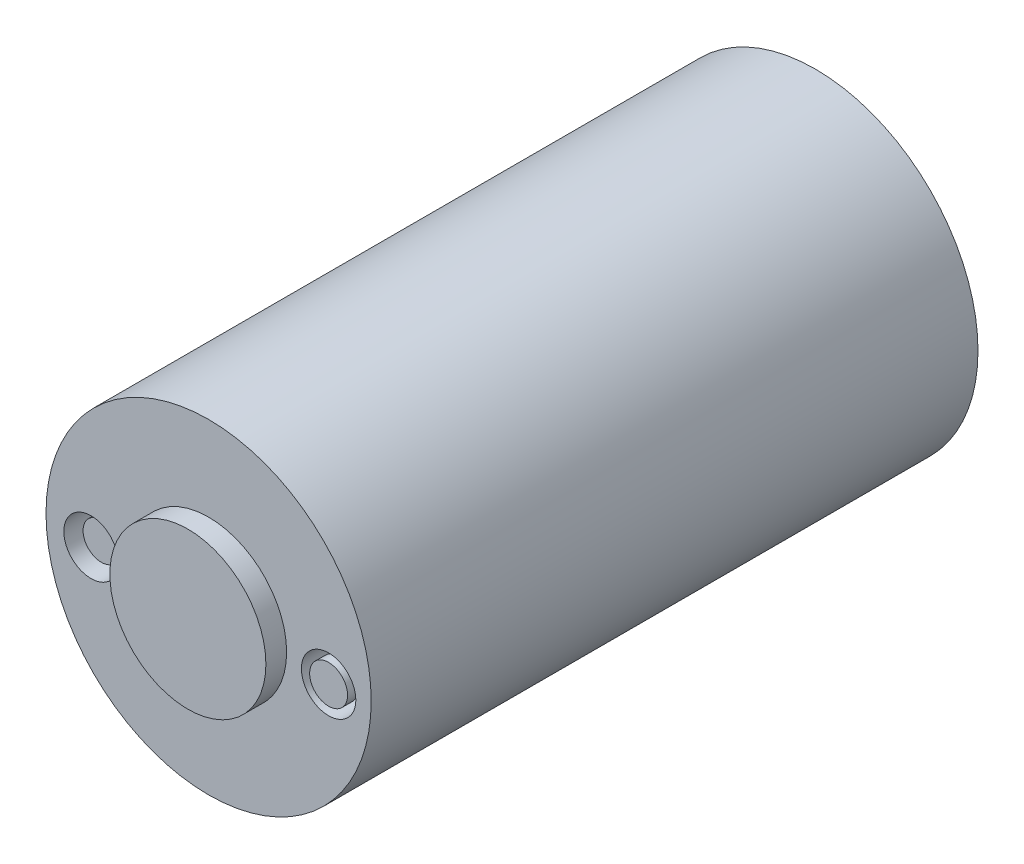
ISO-10303-21;
HEADER;
FILE_DESCRIPTION(('STEP AP214'),'2;1');
FILE_NAME('part.step','',(''),(''),'','','');
FILE_SCHEMA(('AUTOMOTIVE_DESIGN { 1 0 10303 214 1 1 1 1 }'));
ENDSEC;
DATA;
#1=APPLICATION_CONTEXT('core data for automotive mechanical design processes');
#2=APPLICATION_PROTOCOL_DEFINITION('international standard','automotive_design',2000,#1);
#3=PRODUCT_CONTEXT('',#1,'mechanical');
#4=PRODUCT('Part','Part','',(#3));
#5=PRODUCT_RELATED_PRODUCT_CATEGORY('part','',(#4));
#6=PRODUCT_DEFINITION_FORMATION('','',#4);
#7=PRODUCT_DEFINITION_CONTEXT('part definition',#1,'design');
#8=PRODUCT_DEFINITION('design','',#6,#7);
#9=PRODUCT_DEFINITION_SHAPE('','',#8);
#10=(LENGTH_UNIT() NAMED_UNIT(*) SI_UNIT(.MILLI.,.METRE.));
#11=(NAMED_UNIT(*) PLANE_ANGLE_UNIT() SI_UNIT($,.RADIAN.));
#12=(NAMED_UNIT(*) SI_UNIT($,.STERADIAN.) SOLID_ANGLE_UNIT());
#13=UNCERTAINTY_MEASURE_WITH_UNIT(LENGTH_MEASURE(1.E-05),#10,'distance_accuracy_value','');
#14=(GEOMETRIC_REPRESENTATION_CONTEXT(3) GLOBAL_UNCERTAINTY_ASSIGNED_CONTEXT((#13)) GLOBAL_UNIT_ASSIGNED_CONTEXT((#10,
#11,#12)) REPRESENTATION_CONTEXT('',''));
#15=CARTESIAN_POINT('',(0.,0.,0.));
#16=DIRECTION('',(0.,0.,1.));
#17=DIRECTION('',(1.,0.,0.));
#18=AXIS2_PLACEMENT_3D('',#15,#16,#17);
#19=CARTESIAN_POINT('',(-4.24278243774345,8.16431836687368,110.22));
#20=DIRECTION('',(0.,0.,-1.));
#21=DIRECTION('',(-1.,0.,0.));
#22=AXIS2_PLACEMENT_3D('',#19,#20,#21);
#23=CYLINDRICAL_SURFACE('',#22,3.6644848383554);
#24=CARTESIAN_POINT('',(-4.24278243774345,8.16431836687368,110.22));
#25=DIRECTION('',(0.,0.,1.));
#26=DIRECTION('',(1.,0.,0.));
#27=AXIS2_PLACEMENT_3D('',#24,#25,#26);
#28=CIRCLE('',#27,3.6644848383554);
#29=CARTESIAN_POINT('',(-0.578297599388054,8.16431836687368,110.22));
#30=VERTEX_POINT('',#29);
#31=EDGE_CURVE('E11',#30,#30,#28,.T.);
#32=ORIENTED_EDGE('',*,*,#31,.F.);
#33=EDGE_LOOP('',(#32));
#34=FACE_BOUND('',#33,.T.);
#35=CARTESIAN_POINT('',(-4.24278243774345,8.16431836687368,108.22));
#36=DIRECTION('',(0.,0.,1.));
#37=DIRECTION('',(1.,0.,0.));
#38=AXIS2_PLACEMENT_3D('',#35,#36,#37);
#39=CIRCLE('',#38,3.6644848383554);
#40=CARTESIAN_POINT('',(-0.578297599388054,8.16431836687368,108.22));
#41=VERTEX_POINT('',#40);
#42=EDGE_CURVE('E43',#41,#41,#39,.T.);
#43=ORIENTED_EDGE('',*,*,#42,.T.);
#44=EDGE_LOOP('',(#43));
#45=FACE_BOUND('',#44,.T.);
#46=ADVANCED_FACE('F40',(#34,#45),#23,.T.);
#47=CARTESIAN_POINT('',(-4.24278243774345,8.16431836687368,110.22));
#48=DIRECTION('',(0.,0.,1.));
#49=DIRECTION('',(1.,0.,0.));
#50=AXIS2_PLACEMENT_3D('',#47,#48,#49);
#51=PLANE('',#50);
#52=ORIENTED_EDGE('',*,*,#31,.T.);
#53=EDGE_LOOP('',(#52));
#54=FACE_BOUND('',#53,.T.);
#55=ADVANCED_FACE('F55',(#54),#51,.T.);
#56=CARTESIAN_POINT('',(-4.24278243774345,8.16431836687368,108.22));
#57=DIRECTION('',(0.,0.,1.));
#58=DIRECTION('',(1.,0.,0.));
#59=AXIS2_PLACEMENT_3D('',#56,#57,#58);
#60=PLANE('',#59);
#61=ORIENTED_EDGE('',*,*,#42,.F.);
#62=EDGE_LOOP('',(#61));
#63=FACE_BOUND('',#62,.T.);
#64=ADVANCED_FACE('F53',(#63),#60,.F.);
#65=CLOSED_SHELL('',(#46,#55,#64));
#66=MANIFOLD_SOLID_BREP('B2',#65);
#67=CARTESIAN_POINT('',(-27.4092450329609,9.47602080551931,110.22));
#68=DIRECTION('',(0.,0.,-1.));
#69=DIRECTION('',(-1.,0.,0.));
#70=AXIS2_PLACEMENT_3D('',#67,#68,#69);
#71=CYLINDRICAL_SURFACE('',#70,31.385);
#72=CARTESIAN_POINT('',(-27.4092450329609,9.47602080551931,110.22));
#73=DIRECTION('',(0.,0.,1.));
#74=DIRECTION('',(1.,0.,0.));
#75=AXIS2_PLACEMENT_3D('',#72,#73,#74);
#76=CIRCLE('',#75,31.385);
#77=CARTESIAN_POINT('',(3.97575496703907,9.47602080551931,110.22));
#78=VERTEX_POINT('',#77);
#79=EDGE_CURVE('E39',#78,#78,#76,.T.);
#80=ORIENTED_EDGE('',*,*,#79,.F.);
#81=EDGE_LOOP('',(#80));
#82=FACE_BOUND('',#81,.T.);
#83=CARTESIAN_POINT('',(-27.4092450329609,9.47602080551931,-6.91));
#84=DIRECTION('',(0.,0.,-1.));
#85=DIRECTION('',(-1.,0.,0.));
#86=AXIS2_PLACEMENT_3D('',#83,#84,#85);
#87=CIRCLE('',#86,31.385);
#88=CARTESIAN_POINT('',(-58.7942450329609,9.47602080551931,-6.91));
#89=VERTEX_POINT('',#88);
#90=EDGE_CURVE('E112',#89,#89,#87,.T.);
#91=ORIENTED_EDGE('',*,*,#90,.F.);
#92=EDGE_LOOP('',(#91));
#93=FACE_BOUND('',#92,.T.);
#94=ADVANCED_FACE('F80',(#82,#93),#71,.T.);
#95=CARTESIAN_POINT('',(-27.4092450329609,9.47602080551931,110.22));
#96=DIRECTION('',(0.,0.,1.));
#97=DIRECTION('',(1.,0.,0.));
#98=AXIS2_PLACEMENT_3D('',#95,#96,#97);
#99=PLANE('',#98);
#100=CARTESIAN_POINT('',(-50.097416884523,8.16431836687368,110.22));
#101=DIRECTION('',(0.,0.,1.));
#102=DIRECTION('',(1.,0.,0.));
#103=AXIS2_PLACEMENT_3D('',#100,#101,#102);
#104=CIRCLE('',#103,5.255);
#105=CARTESIAN_POINT('',(-44.842416884523,8.16431836687368,110.22));
#106=VERTEX_POINT('',#105);
#107=EDGE_CURVE('E103',#106,#106,#104,.T.);
#108=ORIENTED_EDGE('',*,*,#107,.F.);
#109=EDGE_LOOP('',(#108));
#110=FACE_BOUND('',#109,.T.);
#111=CARTESIAN_POINT('',(-4.24278243774345,8.16431836687368,110.22));
#112=DIRECTION('',(0.,0.,1.));
#113=DIRECTION('',(1.,0.,0.));
#114=AXIS2_PLACEMENT_3D('',#111,#112,#113);
#115=CIRCLE('',#114,5.255);
#116=CARTESIAN_POINT('',(1.01221756225655,8.16431836687368,110.22));
#117=VERTEX_POINT('',#116);
#118=EDGE_CURVE('E97',#117,#117,#115,.T.);
#119=ORIENTED_EDGE('',*,*,#118,.F.);
#120=EDGE_LOOP('',(#119));
#121=FACE_BOUND('',#120,.T.);
#122=CARTESIAN_POINT('',(-27.4092450329609,9.47602080551931,110.22));
#123=DIRECTION('',(0.,0.,1.));
#124=DIRECTION('',(1.,0.,0.));
#125=AXIS2_PLACEMENT_3D('',#122,#123,#124);
#126=CIRCLE('',#125,15.06);
#127=CARTESIAN_POINT('',(-12.3492450329609,9.47602080551931,110.22));
#128=VERTEX_POINT('',#127);
#129=EDGE_CURVE('E90',#128,#128,#126,.T.);
#130=ORIENTED_EDGE('',*,*,#129,.F.);
#131=EDGE_LOOP('',(#130));
#132=FACE_BOUND('',#131,.T.);
#133=ORIENTED_EDGE('',*,*,#79,.T.);
#134=EDGE_LOOP('',(#133));
#135=FACE_BOUND('',#134,.T.);
#136=ADVANCED_FACE('F121',(#110,#121,#132,#135),#99,.T.);
#137=CARTESIAN_POINT('',(-27.4092450329609,9.47602080551931,114.22));
#138=DIRECTION('',(0.,0.,-1.));
#139=DIRECTION('',(-1.,0.,0.));
#140=AXIS2_PLACEMENT_3D('',#137,#138,#139);
#141=CYLINDRICAL_SURFACE('',#140,15.06);
#142=CARTESIAN_POINT('',(-27.4092450329609,9.47602080551931,114.22));
#143=DIRECTION('',(0.,0.,1.));
#144=DIRECTION('',(1.,0.,0.));
#145=AXIS2_PLACEMENT_3D('',#142,#143,#144);
#146=CIRCLE('',#145,15.06);
#147=CARTESIAN_POINT('',(-12.3492450329609,9.47602080551931,114.22));
#148=VERTEX_POINT('',#147);
#149=EDGE_CURVE('E86',#148,#148,#146,.T.);
#150=ORIENTED_EDGE('',*,*,#149,.F.);
#151=EDGE_LOOP('',(#150));
#152=FACE_BOUND('',#151,.T.);
#153=ORIENTED_EDGE('',*,*,#129,.T.);
#154=EDGE_LOOP('',(#153));
#155=FACE_BOUND('',#154,.T.);
#156=ADVANCED_FACE('F126',(#152,#155),#141,.T.);
#157=CARTESIAN_POINT('',(-27.4092450329609,9.47602080551931,114.22));
#158=DIRECTION('',(0.,0.,1.));
#159=DIRECTION('',(1.,0.,0.));
#160=AXIS2_PLACEMENT_3D('',#157,#158,#159);
#161=PLANE('',#160);
#162=ORIENTED_EDGE('',*,*,#149,.T.);
#163=EDGE_LOOP('',(#162));
#164=FACE_BOUND('',#163,.T.);
#165=ADVANCED_FACE('F131',(#164),#161,.T.);
#166=CARTESIAN_POINT('',(-4.24278243774345,8.16431836687368,100.22));
#167=DIRECTION('',(0.,0.,1.));
#168=DIRECTION('',(1.,0.,0.));
#169=AXIS2_PLACEMENT_3D('',#166,#167,#168);
#170=CYLINDRICAL_SURFACE('',#169,5.255);
#171=CARTESIAN_POINT('',(-4.24278243774345,8.16431836687368,100.22));
#172=DIRECTION('',(0.,0.,1.));
#173=DIRECTION('',(1.,0.,0.));
#174=AXIS2_PLACEMENT_3D('',#171,#172,#173);
#175=CIRCLE('',#174,5.255);
#176=CARTESIAN_POINT('',(1.01221756225655,8.16431836687368,100.22));
#177=VERTEX_POINT('',#176);
#178=EDGE_CURVE('E95',#177,#177,#175,.T.);
#179=ORIENTED_EDGE('',*,*,#178,.F.);
#180=EDGE_LOOP('',(#179));
#181=FACE_BOUND('',#180,.T.);
#182=ORIENTED_EDGE('',*,*,#118,.T.);
#183=EDGE_LOOP('',(#182));
#184=FACE_BOUND('',#183,.T.);
#185=ADVANCED_FACE('F139',(#181,#184),#170,.F.);
#186=CARTESIAN_POINT('',(-4.24278243774345,8.16431836687368,100.22));
#187=DIRECTION('',(0.,0.,1.));
#188=DIRECTION('',(1.,0.,0.));
#189=AXIS2_PLACEMENT_3D('',#186,#187,#188);
#190=PLANE('',#189);
#191=ORIENTED_EDGE('',*,*,#178,.T.);
#192=EDGE_LOOP('',(#191));
#193=FACE_BOUND('',#192,.T.);
#194=ADVANCED_FACE('F142',(#193),#190,.T.);
#195=CARTESIAN_POINT('',(-50.097416884523,8.16431836687368,100.22));
#196=DIRECTION('',(0.,0.,1.));
#197=DIRECTION('',(1.,0.,0.));
#198=AXIS2_PLACEMENT_3D('',#195,#196,#197);
#199=CYLINDRICAL_SURFACE('',#198,5.255);
#200=CARTESIAN_POINT('',(-50.097416884523,8.16431836687368,100.22));
#201=DIRECTION('',(0.,0.,1.));
#202=DIRECTION('',(1.,0.,0.));
#203=AXIS2_PLACEMENT_3D('',#200,#201,#202);
#204=CIRCLE('',#203,5.255);
#205=CARTESIAN_POINT('',(-44.842416884523,8.16431836687368,100.22));
#206=VERTEX_POINT('',#205);
#207=EDGE_CURVE('E100',#206,#206,#204,.T.);
#208=ORIENTED_EDGE('',*,*,#207,.F.);
#209=EDGE_LOOP('',(#208));
#210=FACE_BOUND('',#209,.T.);
#211=ORIENTED_EDGE('',*,*,#107,.T.);
#212=EDGE_LOOP('',(#211));
#213=FACE_BOUND('',#212,.T.);
#214=ADVANCED_FACE('F146',(#210,#213),#199,.F.);
#215=CARTESIAN_POINT('',(-50.097416884523,8.16431836687368,100.22));
#216=DIRECTION('',(0.,0.,1.));
#217=DIRECTION('',(1.,0.,0.));
#218=AXIS2_PLACEMENT_3D('',#215,#216,#217);
#219=PLANE('',#218);
#220=CARTESIAN_POINT('',(-50.097416884523,8.16431836687368,100.22));
#221=DIRECTION('',(0.,0.,1.));
#222=DIRECTION('',(1.,0.,0.));
#223=AXIS2_PLACEMENT_3D('',#220,#221,#222);
#224=CIRCLE('',#223,3.54115708482179);
#225=CARTESIAN_POINT('',(-46.5562597997013,8.16431836687368,100.22));
#226=VERTEX_POINT('',#225);
#227=EDGE_CURVE('E109',#226,#226,#224,.T.);
#228=ORIENTED_EDGE('',*,*,#227,.F.);
#229=EDGE_LOOP('',(#228));
#230=FACE_BOUND('',#229,.T.);
#231=ORIENTED_EDGE('',*,*,#207,.T.);
#232=EDGE_LOOP('',(#231));
#233=FACE_BOUND('',#232,.T.);
#234=ADVANCED_FACE('F150',(#230,#233),#219,.T.);
#235=CARTESIAN_POINT('',(-50.097416884523,8.16431836687368,108.22));
#236=DIRECTION('',(0.,0.,-1.));
#237=DIRECTION('',(-1.,0.,0.));
#238=AXIS2_PLACEMENT_3D('',#235,#236,#237);
#239=CYLINDRICAL_SURFACE('',#238,3.54115708482179);
#240=CARTESIAN_POINT('',(-50.097416884523,8.16431836687368,108.22));
#241=DIRECTION('',(0.,0.,1.));
#242=DIRECTION('',(1.,0.,0.));
#243=AXIS2_PLACEMENT_3D('',#240,#241,#242);
#244=CIRCLE('',#243,3.54115708482179);
#245=CARTESIAN_POINT('',(-46.5562597997013,8.16431836687368,108.22));
#246=VERTEX_POINT('',#245);
#247=EDGE_CURVE('E106',#246,#246,#244,.T.);
#248=ORIENTED_EDGE('',*,*,#247,.F.);
#249=EDGE_LOOP('',(#248));
#250=FACE_BOUND('',#249,.T.);
#251=ORIENTED_EDGE('',*,*,#227,.T.);
#252=EDGE_LOOP('',(#251));
#253=FACE_BOUND('',#252,.T.);
#254=ADVANCED_FACE('F154',(#250,#253),#239,.T.);
#255=CARTESIAN_POINT('',(-50.097416884523,8.16431836687368,108.22));
#256=DIRECTION('',(0.,0.,1.));
#257=DIRECTION('',(1.,0.,0.));
#258=AXIS2_PLACEMENT_3D('',#255,#256,#257);
#259=PLANE('',#258);
#260=ORIENTED_EDGE('',*,*,#247,.T.);
#261=EDGE_LOOP('',(#260));
#262=FACE_BOUND('',#261,.T.);
#263=ADVANCED_FACE('F158',(#262),#259,.T.);
#264=CARTESIAN_POINT('',(-27.4092450329609,9.47602080551931,-6.91));
#265=DIRECTION('',(0.,0.,-1.));
#266=DIRECTION('',(-1.,0.,0.));
#267=AXIS2_PLACEMENT_3D('',#264,#265,#266);
#268=PLANE('',#267);
#269=ORIENTED_EDGE('',*,*,#90,.T.);
#270=EDGE_LOOP('',(#269));
#271=FACE_BOUND('',#270,.T.);
#272=ADVANCED_FACE('F118',(#271),#268,.T.);
#273=CLOSED_SHELL('',(#94,#136,#156,#165,#185,#194,#214,#234,#254,#263,#272));
#274=MANIFOLD_SOLID_BREP('B6',#273);
#275=ADVANCED_BREP_SHAPE_REPRESENTATION('',(#18,#66,#274),#14);
#276=SHAPE_DEFINITION_REPRESENTATION(#9,#275);
ENDSEC;
END-ISO-10303-21;
